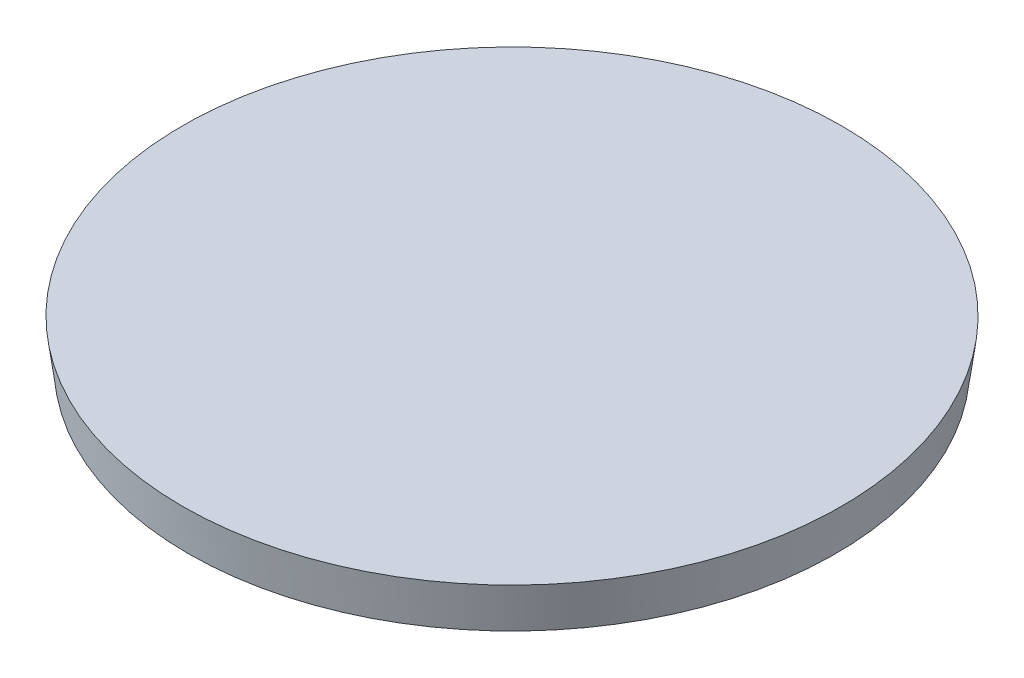
ISO-10303-21;
HEADER;
FILE_DESCRIPTION(('STEP AP214'),'2;1');
FILE_NAME('part.step','',(''),(''),'','','');
FILE_SCHEMA(('AUTOMOTIVE_DESIGN { 1 0 10303 214 1 1 1 1 }'));
ENDSEC;
DATA;
#1=APPLICATION_CONTEXT('core data for automotive mechanical design processes');
#2=APPLICATION_PROTOCOL_DEFINITION('international standard','automotive_design',2000,#1);
#3=PRODUCT_CONTEXT('',#1,'mechanical');
#4=PRODUCT('Part','Part','',(#3));
#5=PRODUCT_RELATED_PRODUCT_CATEGORY('part','',(#4));
#6=PRODUCT_DEFINITION_FORMATION('','',#4);
#7=PRODUCT_DEFINITION_CONTEXT('part definition',#1,'design');
#8=PRODUCT_DEFINITION('design','',#6,#7);
#9=PRODUCT_DEFINITION_SHAPE('','',#8);
#10=(LENGTH_UNIT() NAMED_UNIT(*) SI_UNIT(.MILLI.,.METRE.));
#11=(NAMED_UNIT(*) PLANE_ANGLE_UNIT() SI_UNIT($,.RADIAN.));
#12=(NAMED_UNIT(*) SI_UNIT($,.STERADIAN.) SOLID_ANGLE_UNIT());
#13=UNCERTAINTY_MEASURE_WITH_UNIT(LENGTH_MEASURE(1.E-05),#10,'distance_accuracy_value','');
#14=(GEOMETRIC_REPRESENTATION_CONTEXT(3) GLOBAL_UNCERTAINTY_ASSIGNED_CONTEXT((#13)) GLOBAL_UNIT_ASSIGNED_CONTEXT((#10,
#11,#12)) REPRESENTATION_CONTEXT('',''));
#15=CARTESIAN_POINT('',(0.,0.,0.));
#16=DIRECTION('',(0.,0.,1.));
#17=DIRECTION('',(1.,0.,0.));
#18=AXIS2_PLACEMENT_3D('',#15,#16,#17);
#19=CARTESIAN_POINT('',(0.,0.,0.));
#20=DIRECTION('',(0.,1.,0.));
#21=DIRECTION('',(0.,0.,1.));
#22=AXIS2_PLACEMENT_3D('',#19,#20,#21);
#23=PLANE('',#22);
#24=CARTESIAN_POINT('',(0.,0.,0.));
#25=DIRECTION('',(0.,1.,0.));
#26=DIRECTION('',(0.,0.,1.));
#27=AXIS2_PLACEMENT_3D('',#24,#25,#26);
#28=CIRCLE('',#27,11.2395);
#29=CARTESIAN_POINT('',(0.,0.,11.2395));
#30=VERTEX_POINT('',#29);
#31=EDGE_CURVE('E10',#30,#30,#28,.T.);
#32=ORIENTED_EDGE('',*,*,#31,.F.);
#33=EDGE_LOOP('',(#32));
#34=FACE_BOUND('',#33,.T.);
#35=ADVANCED_FACE('F37',(#34),#23,.F.);
#36=CARTESIAN_POINT('',(0.,0.,0.));
#37=DIRECTION('',(0.,1.,0.));
#38=DIRECTION('',(0.,0.,1.));
#39=AXIS2_PLACEMENT_3D('',#36,#37,#38);
#40=CONICAL_SURFACE('',#39,11.2395,0.130899693899567);
#41=CARTESIAN_POINT('',(0.,1.524,0.));
#42=DIRECTION('',(0.,1.,0.));
#43=DIRECTION('',(0.,0.,1.));
#44=AXIS2_PLACEMENT_3D('',#41,#42,#43);
#45=CIRCLE('',#44,11.4401384063232);
#46=CARTESIAN_POINT('',(0.,1.524,11.4401384063232));
#47=VERTEX_POINT('',#46);
#48=EDGE_CURVE('E43',#47,#47,#45,.T.);
#49=ORIENTED_EDGE('',*,*,#48,.F.);
#50=EDGE_LOOP('',(#49));
#51=FACE_BOUND('',#50,.T.);
#52=ORIENTED_EDGE('',*,*,#31,.T.);
#53=EDGE_LOOP('',(#52));
#54=FACE_BOUND('',#53,.T.);
#55=ADVANCED_FACE('F51',(#51,#54),#40,.T.);
#56=CARTESIAN_POINT('',(11.4401384063232,1.524,0.));
#57=DIRECTION('',(0.,-1.,0.));
#58=DIRECTION('',(0.,0.,-1.));
#59=AXIS2_PLACEMENT_3D('',#56,#57,#58);
#60=PLANE('',#59);
#61=ORIENTED_EDGE('',*,*,#48,.T.);
#62=EDGE_LOOP('',(#61));
#63=FACE_BOUND('',#62,.T.);
#64=ADVANCED_FACE('F49',(#63),#60,.F.);
#65=CLOSED_SHELL('',(#35,#55,#64));
#66=MANIFOLD_SOLID_BREP('B2',#65);
#67=ADVANCED_BREP_SHAPE_REPRESENTATION('',(#18,#66),#14);
#68=SHAPE_DEFINITION_REPRESENTATION(#9,#67);
ENDSEC;
END-ISO-10303-21;
